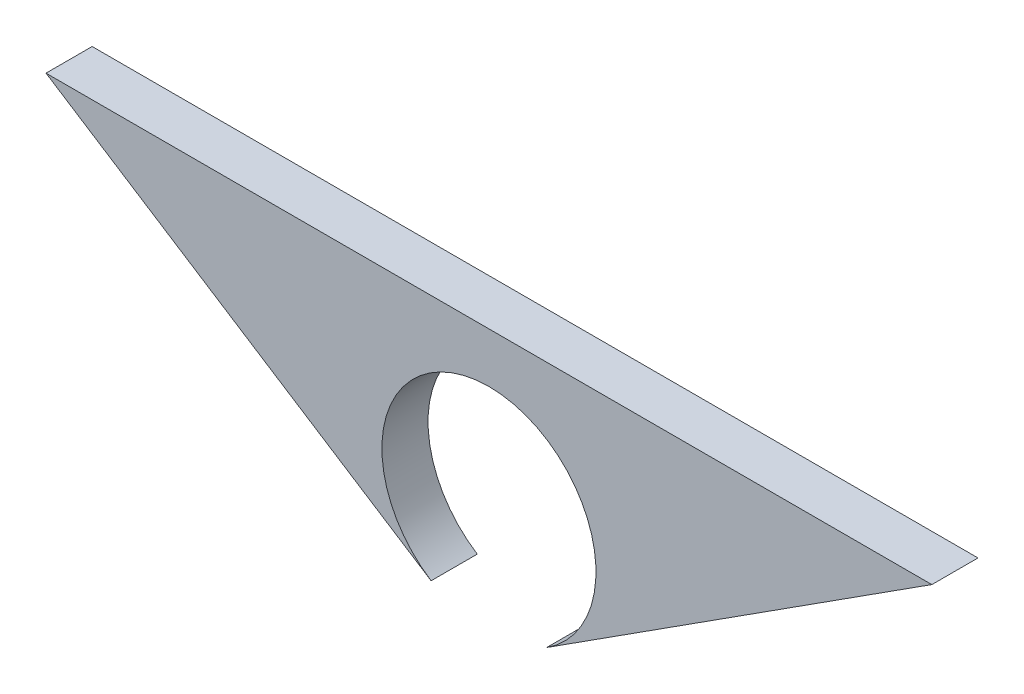
ISO-10303-21;
HEADER;
FILE_DESCRIPTION(('STEP AP214'),'2;1');
FILE_NAME('part.step','',(''),(''),'','','');
FILE_SCHEMA(('AUTOMOTIVE_DESIGN { 1 0 10303 214 1 1 1 1 }'));
ENDSEC;
DATA;
#1=APPLICATION_CONTEXT('core data for automotive mechanical design processes');
#2=APPLICATION_PROTOCOL_DEFINITION('international standard','automotive_design',2000,#1);
#3=PRODUCT_CONTEXT('',#1,'mechanical');
#4=PRODUCT('Part','Part','',(#3));
#5=PRODUCT_RELATED_PRODUCT_CATEGORY('part','',(#4));
#6=PRODUCT_DEFINITION_FORMATION('','',#4);
#7=PRODUCT_DEFINITION_CONTEXT('part definition',#1,'design');
#8=PRODUCT_DEFINITION('design','',#6,#7);
#9=PRODUCT_DEFINITION_SHAPE('','',#8);
#10=(LENGTH_UNIT() NAMED_UNIT(*) SI_UNIT(.MILLI.,.METRE.));
#11=(NAMED_UNIT(*) PLANE_ANGLE_UNIT() SI_UNIT($,.RADIAN.));
#12=(NAMED_UNIT(*) SI_UNIT($,.STERADIAN.) SOLID_ANGLE_UNIT());
#13=UNCERTAINTY_MEASURE_WITH_UNIT(LENGTH_MEASURE(1.E-05),#10,'distance_accuracy_value','');
#14=(GEOMETRIC_REPRESENTATION_CONTEXT(3) GLOBAL_UNCERTAINTY_ASSIGNED_CONTEXT((#13)) GLOBAL_UNIT_ASSIGNED_CONTEXT((#10,
#11,#12)) REPRESENTATION_CONTEXT('',''));
#15=CARTESIAN_POINT('',(0.,0.,0.));
#16=DIRECTION('',(0.,0.,1.));
#17=DIRECTION('',(1.,0.,0.));
#18=AXIS2_PLACEMENT_3D('',#15,#16,#17);
#19=CARTESIAN_POINT('',(-15.24,5.4,1.5875));
#20=DIRECTION('',(0.539913981173731,0.841720198719938,0.));
#21=DIRECTION('',(-0.841720198719938,0.539913981173731,0.));
#22=AXIS2_PLACEMENT_3D('',#19,#20,#21);
#23=PLANE('',#22);
#24=DIRECTION('',(0.841720198719938,-0.539913981173731,0.));
#25=VECTOR('',#24,1.);
#26=CARTESIAN_POINT('',(-15.24,5.4,0.));
#27=LINE('',#26,#25);
#28=CARTESIAN_POINT('',(-15.24,5.4,0.));
#29=VERTEX_POINT('',#28);
#30=CARTESIAN_POINT('',(-1.98850319266286,-3.10005549188553,0.));
#31=VERTEX_POINT('',#30);
#32=EDGE_CURVE('E94',#29,#31,#27,.T.);
#33=ORIENTED_EDGE('',*,*,#32,.T.);
#34=DIRECTION('',(0.,0.,-1.));
#35=VECTOR('',#34,1.);
#36=CARTESIAN_POINT('',(-1.98850319266286,-3.10005549188553,1.5875));
#37=LINE('',#36,#35);
#38=CARTESIAN_POINT('',(-1.98850319266286,-3.10005549188553,1.5875));
#39=VERTEX_POINT('',#38);
#40=EDGE_CURVE('E11',#39,#31,#37,.T.);
#41=ORIENTED_EDGE('',*,*,#40,.F.);
#42=DIRECTION('',(0.841720198719938,-0.539913981173731,0.));
#43=VECTOR('',#42,1.);
#44=CARTESIAN_POINT('',(-15.24,5.4,1.5875));
#45=LINE('',#44,#43);
#46=CARTESIAN_POINT('',(-15.24,5.4,1.5875));
#47=VERTEX_POINT('',#46);
#48=EDGE_CURVE('E82',#47,#39,#45,.T.);
#49=ORIENTED_EDGE('',*,*,#48,.F.);
#50=DIRECTION('',(0.,0.,-1.));
#51=VECTOR('',#50,1.);
#52=CARTESIAN_POINT('',(-15.24,5.4,1.5875));
#53=LINE('',#52,#51);
#54=EDGE_CURVE('E90',#47,#29,#53,.T.);
#55=ORIENTED_EDGE('',*,*,#54,.T.);
#56=EDGE_LOOP('',(#33,#41,#49,#55));
#57=FACE_BOUND('',#56,.T.);
#58=ADVANCED_FACE('F31',(#57),#23,.F.);
#59=CARTESIAN_POINT('',(0.,0.,1.5875));
#60=DIRECTION('',(0.,0.,-1.));
#61=DIRECTION('',(-1.,0.,0.));
#62=AXIS2_PLACEMENT_3D('',#59,#60,#61);
#63=CYLINDRICAL_SURFACE('',#62,3.683);
#64=CARTESIAN_POINT('',(0.,0.,0.));
#65=DIRECTION('',(0.,0.,-1.));
#66=DIRECTION('',(1.,0.,0.));
#67=AXIS2_PLACEMENT_3D('',#64,#65,#66);
#68=CIRCLE('',#67,3.683);
#69=CARTESIAN_POINT('',(1.98850319266285,-3.10005549188553,0.));
#70=VERTEX_POINT('',#69);
#71=EDGE_CURVE('E86',#31,#70,#68,.T.);
#72=ORIENTED_EDGE('',*,*,#71,.T.);
#73=DIRECTION('',(0.,0.,-1.));
#74=VECTOR('',#73,1.);
#75=CARTESIAN_POINT('',(1.98850319266285,-3.10005549188553,1.5875));
#76=LINE('',#75,#74);
#77=CARTESIAN_POINT('',(1.98850319266285,-3.10005549188553,1.5875));
#78=VERTEX_POINT('',#77);
#79=EDGE_CURVE('E39',#78,#70,#76,.T.);
#80=ORIENTED_EDGE('',*,*,#79,.F.);
#81=CARTESIAN_POINT('',(0.,0.,1.5875));
#82=DIRECTION('',(0.,0.,-1.));
#83=DIRECTION('',(1.,0.,0.));
#84=AXIS2_PLACEMENT_3D('',#81,#82,#83);
#85=CIRCLE('',#84,3.683);
#86=EDGE_CURVE('E77',#39,#78,#85,.T.);
#87=ORIENTED_EDGE('',*,*,#86,.F.);
#88=ORIENTED_EDGE('',*,*,#40,.T.);
#89=EDGE_LOOP('',(#72,#80,#87,#88));
#90=FACE_BOUND('',#89,.T.);
#91=ADVANCED_FACE('F85',(#90),#63,.F.);
#92=CARTESIAN_POINT('',(15.24,5.4,1.5875));
#93=DIRECTION('',(-0.539913981173731,0.841720198719938,0.));
#94=DIRECTION('',(-0.841720198719938,-0.539913981173731,0.));
#95=AXIS2_PLACEMENT_3D('',#92,#93,#94);
#96=PLANE('',#95);
#97=DIRECTION('',(0.841720198719938,0.539913981173731,0.));
#98=VECTOR('',#97,1.);
#99=CARTESIAN_POINT('',(15.24,5.4,0.));
#100=LINE('',#99,#98);
#101=CARTESIAN_POINT('',(15.24,5.4,0.));
#102=VERTEX_POINT('',#101);
#103=EDGE_CURVE('E64',#70,#102,#100,.T.);
#104=ORIENTED_EDGE('',*,*,#103,.T.);
#105=DIRECTION('',(0.,0.,-1.));
#106=VECTOR('',#105,1.);
#107=CARTESIAN_POINT('',(15.24,5.4,1.5875));
#108=LINE('',#107,#106);
#109=CARTESIAN_POINT('',(15.24,5.4,1.5875));
#110=VERTEX_POINT('',#109);
#111=EDGE_CURVE('E87',#110,#102,#108,.T.);
#112=ORIENTED_EDGE('',*,*,#111,.F.);
#113=DIRECTION('',(0.841720198719938,0.539913981173731,0.));
#114=VECTOR('',#113,1.);
#115=CARTESIAN_POINT('',(15.24,5.4,1.5875));
#116=LINE('',#115,#114);
#117=EDGE_CURVE('E80',#78,#110,#116,.T.);
#118=ORIENTED_EDGE('',*,*,#117,.F.);
#119=ORIENTED_EDGE('',*,*,#79,.T.);
#120=EDGE_LOOP('',(#104,#112,#118,#119));
#121=FACE_BOUND('',#120,.T.);
#122=ADVANCED_FACE('F88',(#121),#96,.F.);
#123=CARTESIAN_POINT('',(-15.24,5.4,1.5875));
#124=DIRECTION('',(0.,-1.,0.));
#125=DIRECTION('',(0.,0.,-1.));
#126=AXIS2_PLACEMENT_3D('',#123,#124,#125);
#127=PLANE('',#126);
#128=DIRECTION('',(-1.,0.,0.));
#129=VECTOR('',#128,1.);
#130=CARTESIAN_POINT('',(-15.24,5.4,0.));
#131=LINE('',#130,#129);
#132=EDGE_CURVE('E70',#102,#29,#131,.T.);
#133=ORIENTED_EDGE('',*,*,#132,.T.);
#134=ORIENTED_EDGE('',*,*,#54,.F.);
#135=DIRECTION('',(-1.,0.,0.));
#136=VECTOR('',#135,1.);
#137=CARTESIAN_POINT('',(-15.24,5.4,1.5875));
#138=LINE('',#137,#136);
#139=EDGE_CURVE('E47',#110,#47,#138,.T.);
#140=ORIENTED_EDGE('',*,*,#139,.F.);
#141=ORIENTED_EDGE('',*,*,#111,.T.);
#142=EDGE_LOOP('',(#133,#134,#140,#141));
#143=FACE_BOUND('',#142,.T.);
#144=ADVANCED_FACE('F101',(#143),#127,.F.);
#145=CARTESIAN_POINT('',(0.,0.,1.5875));
#146=DIRECTION('',(0.,0.,1.));
#147=DIRECTION('',(1.,0.,0.));
#148=AXIS2_PLACEMENT_3D('',#145,#146,#147);
#149=PLANE('',#148);
#150=ORIENTED_EDGE('',*,*,#48,.T.);
#151=ORIENTED_EDGE('',*,*,#86,.T.);
#152=ORIENTED_EDGE('',*,*,#117,.T.);
#153=ORIENTED_EDGE('',*,*,#139,.T.);
#154=EDGE_LOOP('',(#150,#151,#152,#153));
#155=FACE_BOUND('',#154,.T.);
#156=ADVANCED_FACE('F78',(#155),#149,.T.);
#157=CARTESIAN_POINT('',(0.,0.,0.));
#158=DIRECTION('',(0.,0.,1.));
#159=DIRECTION('',(1.,0.,0.));
#160=AXIS2_PLACEMENT_3D('',#157,#158,#159);
#161=PLANE('',#160);
#162=ORIENTED_EDGE('',*,*,#32,.F.);
#163=ORIENTED_EDGE('',*,*,#132,.F.);
#164=ORIENTED_EDGE('',*,*,#103,.F.);
#165=ORIENTED_EDGE('',*,*,#71,.F.);
#166=EDGE_LOOP('',(#162,#163,#164,#165));
#167=FACE_BOUND('',#166,.T.);
#168=ADVANCED_FACE('F104',(#167),#161,.F.);
#169=CLOSED_SHELL('',(#58,#91,#122,#144,#156,#168));
#170=MANIFOLD_SOLID_BREP('B2',#169);
#171=ADVANCED_BREP_SHAPE_REPRESENTATION('',(#18,#170),#14);
#172=SHAPE_DEFINITION_REPRESENTATION(#9,#171);
ENDSEC;
END-ISO-10303-21;
